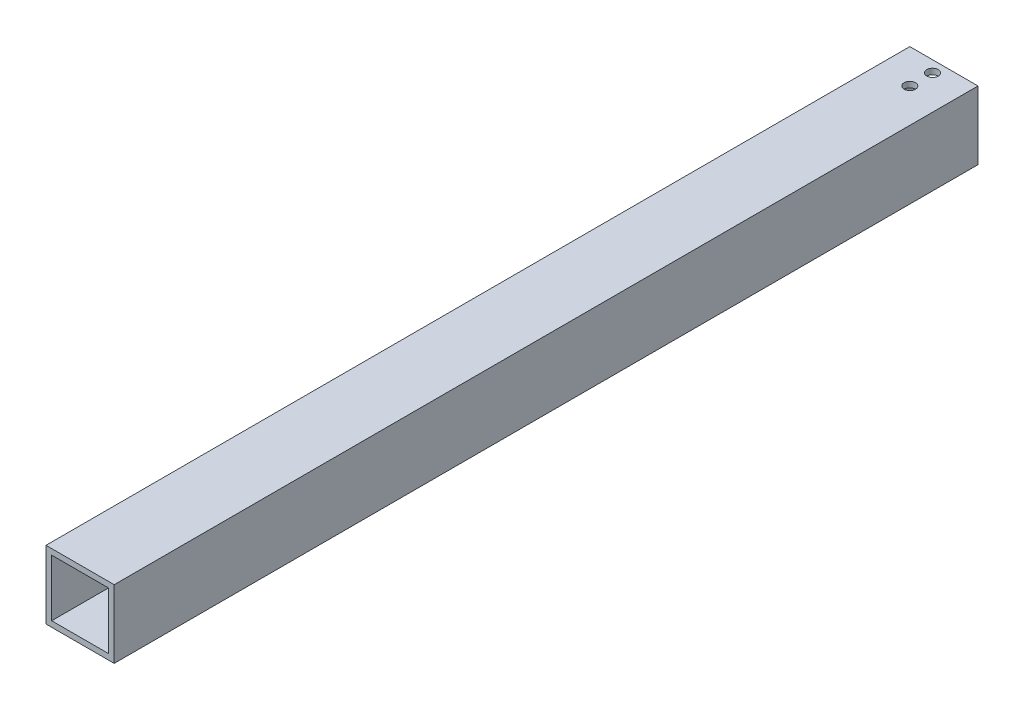
ISO-10303-21;
HEADER;
FILE_DESCRIPTION(('STEP AP214'),'2;1');
FILE_NAME('part.step','',(''),(''),'','','');
FILE_SCHEMA(('AUTOMOTIVE_DESIGN { 1 0 10303 214 1 1 1 1 }'));
ENDSEC;
DATA;
#1=APPLICATION_CONTEXT('core data for automotive mechanical design processes');
#2=APPLICATION_PROTOCOL_DEFINITION('international standard','automotive_design',2000,#1);
#3=PRODUCT_CONTEXT('',#1,'mechanical');
#4=PRODUCT('Part','Part','',(#3));
#5=PRODUCT_RELATED_PRODUCT_CATEGORY('part','',(#4));
#6=PRODUCT_DEFINITION_FORMATION('','',#4);
#7=PRODUCT_DEFINITION_CONTEXT('part definition',#1,'design');
#8=PRODUCT_DEFINITION('design','',#6,#7);
#9=PRODUCT_DEFINITION_SHAPE('','',#8);
#10=(LENGTH_UNIT() NAMED_UNIT(*) SI_UNIT(.MILLI.,.METRE.));
#11=(NAMED_UNIT(*) PLANE_ANGLE_UNIT() SI_UNIT($,.RADIAN.));
#12=(NAMED_UNIT(*) SI_UNIT($,.STERADIAN.) SOLID_ANGLE_UNIT());
#13=UNCERTAINTY_MEASURE_WITH_UNIT(LENGTH_MEASURE(1.E-05),#10,'distance_accuracy_value','');
#14=(GEOMETRIC_REPRESENTATION_CONTEXT(3) GLOBAL_UNCERTAINTY_ASSIGNED_CONTEXT((#13)) GLOBAL_UNIT_ASSIGNED_CONTEXT((#10,
#11,#12)) REPRESENTATION_CONTEXT('',''));
#15=CARTESIAN_POINT('',(0.,0.,0.));
#16=DIRECTION('',(0.,0.,1.));
#17=DIRECTION('',(1.,0.,0.));
#18=AXIS2_PLACEMENT_3D('',#15,#16,#17);
#19=CARTESIAN_POINT('',(0.,0.,482.6));
#20=DIRECTION('',(0.,0.,1.));
#21=DIRECTION('',(1.,0.,0.));
#22=AXIS2_PLACEMENT_3D('',#19,#20,#21);
#23=PLANE('',#22);
#24=DIRECTION('',(0.,1.,0.));
#25=VECTOR('',#24,1.);
#26=CARTESIAN_POINT('',(19.05,19.05,482.6));
#27=LINE('',#26,#25);
#28=CARTESIAN_POINT('',(19.05,-19.05,482.6));
#29=VERTEX_POINT('',#28);
#30=CARTESIAN_POINT('',(19.05,19.05,482.6));
#31=VERTEX_POINT('',#30);
#32=EDGE_CURVE('E144',#29,#31,#27,.T.);
#33=ORIENTED_EDGE('',*,*,#32,.T.);
#34=DIRECTION('',(-1.,0.,0.));
#35=VECTOR('',#34,1.);
#36=CARTESIAN_POINT('',(-19.05,19.05,482.6));
#37=LINE('',#36,#35);
#38=CARTESIAN_POINT('',(-19.05,19.05,482.6));
#39=VERTEX_POINT('',#38);
#40=EDGE_CURVE('E147',#31,#39,#37,.T.);
#41=ORIENTED_EDGE('',*,*,#40,.T.);
#42=DIRECTION('',(0.,-1.,0.));
#43=VECTOR('',#42,1.);
#44=CARTESIAN_POINT('',(-19.05,19.05,482.6));
#45=LINE('',#44,#43);
#46=CARTESIAN_POINT('',(-19.05,-19.05,482.6));
#47=VERTEX_POINT('',#46);
#48=EDGE_CURVE('E150',#39,#47,#45,.T.);
#49=ORIENTED_EDGE('',*,*,#48,.T.);
#50=DIRECTION('',(1.,0.,0.));
#51=VECTOR('',#50,1.);
#52=CARTESIAN_POINT('',(-19.05,-19.05,482.6));
#53=LINE('',#52,#51);
#54=EDGE_CURVE('E152',#47,#29,#53,.T.);
#55=ORIENTED_EDGE('',*,*,#54,.T.);
#56=EDGE_LOOP('',(#33,#41,#49,#55));
#57=FACE_BOUND('',#56,.T.);
#58=DIRECTION('',(-1.,0.,0.));
#59=VECTOR('',#58,1.);
#60=CARTESIAN_POINT('',(-15.875,15.875,482.6));
#61=LINE('',#60,#59);
#62=CARTESIAN_POINT('',(15.875,15.875,482.6));
#63=VERTEX_POINT('',#62);
#64=CARTESIAN_POINT('',(-15.875,15.875,482.6));
#65=VERTEX_POINT('',#64);
#66=EDGE_CURVE('E114',#63,#65,#61,.T.);
#67=ORIENTED_EDGE('',*,*,#66,.F.);
#68=DIRECTION('',(0.,1.,0.));
#69=VECTOR('',#68,1.);
#70=CARTESIAN_POINT('',(15.875,-15.875,482.6));
#71=LINE('',#70,#69);
#72=CARTESIAN_POINT('',(15.875,-15.875,482.6));
#73=VERTEX_POINT('',#72);
#74=EDGE_CURVE('E106',#73,#63,#71,.T.);
#75=ORIENTED_EDGE('',*,*,#74,.F.);
#76=DIRECTION('',(1.,0.,0.));
#77=VECTOR('',#76,1.);
#78=CARTESIAN_POINT('',(-15.875,-15.875,482.6));
#79=LINE('',#78,#77);
#80=CARTESIAN_POINT('',(-15.875,-15.875,482.6));
#81=VERTEX_POINT('',#80);
#82=EDGE_CURVE('E128',#81,#73,#79,.T.);
#83=ORIENTED_EDGE('',*,*,#82,.F.);
#84=DIRECTION('',(0.,-1.,0.));
#85=VECTOR('',#84,1.);
#86=CARTESIAN_POINT('',(-15.875,-15.875,482.6));
#87=LINE('',#86,#85);
#88=EDGE_CURVE('E126',#65,#81,#87,.T.);
#89=ORIENTED_EDGE('',*,*,#88,.F.);
#90=EDGE_LOOP('',(#67,#75,#83,#89));
#91=FACE_BOUND('',#90,.T.);
#92=ADVANCED_FACE('F39',(#57,#91),#23,.T.);
#93=CARTESIAN_POINT('',(0.,0.,0.));
#94=DIRECTION('',(0.,0.,1.));
#95=DIRECTION('',(1.,0.,0.));
#96=AXIS2_PLACEMENT_3D('',#93,#94,#95);
#97=PLANE('',#96);
#98=DIRECTION('',(0.,1.,0.));
#99=VECTOR('',#98,1.);
#100=CARTESIAN_POINT('',(19.05,19.05,0.));
#101=LINE('',#100,#99);
#102=CARTESIAN_POINT('',(19.05,-19.05,0.));
#103=VERTEX_POINT('',#102);
#104=CARTESIAN_POINT('',(19.05,19.05,0.));
#105=VERTEX_POINT('',#104);
#106=EDGE_CURVE('E122',#103,#105,#101,.T.);
#107=ORIENTED_EDGE('',*,*,#106,.F.);
#108=DIRECTION('',(1.,0.,0.));
#109=VECTOR('',#108,1.);
#110=CARTESIAN_POINT('',(-19.05,-19.05,0.));
#111=LINE('',#110,#109);
#112=CARTESIAN_POINT('',(-19.05,-19.05,0.));
#113=VERTEX_POINT('',#112);
#114=EDGE_CURVE('E148',#113,#103,#111,.T.);
#115=ORIENTED_EDGE('',*,*,#114,.F.);
#116=DIRECTION('',(0.,-1.,0.));
#117=VECTOR('',#116,1.);
#118=CARTESIAN_POINT('',(-19.05,19.05,0.));
#119=LINE('',#118,#117);
#120=CARTESIAN_POINT('',(-19.05,19.05,0.));
#121=VERTEX_POINT('',#120);
#122=EDGE_CURVE('E159',#121,#113,#119,.T.);
#123=ORIENTED_EDGE('',*,*,#122,.F.);
#124=DIRECTION('',(-1.,0.,0.));
#125=VECTOR('',#124,1.);
#126=CARTESIAN_POINT('',(-19.05,19.05,0.));
#127=LINE('',#126,#125);
#128=EDGE_CURVE('E157',#105,#121,#127,.T.);
#129=ORIENTED_EDGE('',*,*,#128,.F.);
#130=EDGE_LOOP('',(#107,#115,#123,#129));
#131=FACE_BOUND('',#130,.T.);
#132=DIRECTION('',(0.,1.,0.));
#133=VECTOR('',#132,1.);
#134=CARTESIAN_POINT('',(15.875,-15.875,0.));
#135=LINE('',#134,#133);
#136=CARTESIAN_POINT('',(15.875,-15.875,0.));
#137=VERTEX_POINT('',#136);
#138=CARTESIAN_POINT('',(15.875,15.875,0.));
#139=VERTEX_POINT('',#138);
#140=EDGE_CURVE('E64',#137,#139,#135,.T.);
#141=ORIENTED_EDGE('',*,*,#140,.T.);
#142=DIRECTION('',(-1.,0.,0.));
#143=VECTOR('',#142,1.);
#144=CARTESIAN_POINT('',(-15.875,15.875,0.));
#145=LINE('',#144,#143);
#146=CARTESIAN_POINT('',(-15.875,15.875,0.));
#147=VERTEX_POINT('',#146);
#148=EDGE_CURVE('E121',#139,#147,#145,.T.);
#149=ORIENTED_EDGE('',*,*,#148,.T.);
#150=DIRECTION('',(0.,-1.,0.));
#151=VECTOR('',#150,1.);
#152=CARTESIAN_POINT('',(-15.875,-15.875,0.));
#153=LINE('',#152,#151);
#154=CARTESIAN_POINT('',(-15.875,-15.875,0.));
#155=VERTEX_POINT('',#154);
#156=EDGE_CURVE('E136',#147,#155,#153,.T.);
#157=ORIENTED_EDGE('',*,*,#156,.T.);
#158=DIRECTION('',(1.,0.,0.));
#159=VECTOR('',#158,1.);
#160=CARTESIAN_POINT('',(-15.875,-15.875,0.));
#161=LINE('',#160,#159);
#162=EDGE_CURVE('E115',#155,#137,#161,.T.);
#163=ORIENTED_EDGE('',*,*,#162,.T.);
#164=EDGE_LOOP('',(#141,#149,#157,#163));
#165=FACE_BOUND('',#164,.T.);
#166=ADVANCED_FACE('F206',(#131,#165),#97,.F.);
#167=CARTESIAN_POINT('',(19.05,19.05,482.6));
#168=DIRECTION('',(-1.,0.,0.));
#169=DIRECTION('',(0.,-1.,0.));
#170=AXIS2_PLACEMENT_3D('',#167,#168,#169);
#171=PLANE('',#170);
#172=ORIENTED_EDGE('',*,*,#106,.T.);
#173=DIRECTION('',(0.,0.,-1.));
#174=VECTOR('',#173,1.);
#175=CARTESIAN_POINT('',(19.05,19.05,482.6));
#176=LINE('',#175,#174);
#177=EDGE_CURVE('E11',#31,#105,#176,.T.);
#178=ORIENTED_EDGE('',*,*,#177,.F.);
#179=ORIENTED_EDGE('',*,*,#32,.F.);
#180=DIRECTION('',(0.,0.,-1.));
#181=VECTOR('',#180,1.);
#182=CARTESIAN_POINT('',(19.05,-19.05,482.6));
#183=LINE('',#182,#181);
#184=EDGE_CURVE('E154',#29,#103,#183,.T.);
#185=ORIENTED_EDGE('',*,*,#184,.T.);
#186=EDGE_LOOP('',(#172,#178,#179,#185));
#187=FACE_BOUND('',#186,.T.);
#188=ADVANCED_FACE('F41',(#187),#171,.F.);
#189=CARTESIAN_POINT('',(-19.05,19.05,482.6));
#190=DIRECTION('',(0.,-1.,0.));
#191=DIRECTION('',(0.,0.,-1.));
#192=AXIS2_PLACEMENT_3D('',#189,#190,#191);
#193=PLANE('',#192);
#194=CARTESIAN_POINT('',(0.,19.05,19.05));
#195=DIRECTION('',(0.,1.,0.));
#196=DIRECTION('',(0.,0.,1.));
#197=AXIS2_PLACEMENT_3D('',#194,#195,#196);
#198=CIRCLE('',#197,3.175);
#199=CARTESIAN_POINT('',(0.,19.05,22.225));
#200=VERTEX_POINT('',#199);
#201=EDGE_CURVE('E177',#200,#200,#198,.T.);
#202=ORIENTED_EDGE('',*,*,#201,.F.);
#203=EDGE_LOOP('',(#202));
#204=FACE_BOUND('',#203,.T.);
#205=CARTESIAN_POINT('',(0.,19.05,6.35000000000002));
#206=DIRECTION('',(0.,1.,0.));
#207=DIRECTION('',(0.,0.,1.));
#208=AXIS2_PLACEMENT_3D('',#205,#206,#207);
#209=CIRCLE('',#208,3.175);
#210=CARTESIAN_POINT('',(0.,19.05,9.52500000000002));
#211=VERTEX_POINT('',#210);
#212=EDGE_CURVE('E182',#211,#211,#209,.T.);
#213=ORIENTED_EDGE('',*,*,#212,.F.);
#214=EDGE_LOOP('',(#213));
#215=FACE_BOUND('',#214,.T.);
#216=ORIENTED_EDGE('',*,*,#128,.T.);
#217=DIRECTION('',(0.,0.,-1.));
#218=VECTOR('',#217,1.);
#219=CARTESIAN_POINT('',(-19.05,19.05,482.6));
#220=LINE('',#219,#218);
#221=EDGE_CURVE('E48',#39,#121,#220,.T.);
#222=ORIENTED_EDGE('',*,*,#221,.F.);
#223=ORIENTED_EDGE('',*,*,#40,.F.);
#224=ORIENTED_EDGE('',*,*,#177,.T.);
#225=EDGE_LOOP('',(#216,#222,#223,#224));
#226=FACE_BOUND('',#225,.T.);
#227=ADVANCED_FACE('F230',(#204,#215,#226),#193,.F.);
#228=CARTESIAN_POINT('',(-19.05,19.05,482.6));
#229=DIRECTION('',(1.,0.,0.));
#230=DIRECTION('',(0.,0.,-1.));
#231=AXIS2_PLACEMENT_3D('',#228,#229,#230);
#232=PLANE('',#231);
#233=ORIENTED_EDGE('',*,*,#122,.T.);
#234=DIRECTION('',(0.,0.,-1.));
#235=VECTOR('',#234,1.);
#236=CARTESIAN_POINT('',(-19.05,-19.05,482.6));
#237=LINE('',#236,#235);
#238=EDGE_CURVE('E164',#47,#113,#237,.T.);
#239=ORIENTED_EDGE('',*,*,#238,.F.);
#240=ORIENTED_EDGE('',*,*,#48,.F.);
#241=ORIENTED_EDGE('',*,*,#221,.T.);
#242=EDGE_LOOP('',(#233,#239,#240,#241));
#243=FACE_BOUND('',#242,.T.);
#244=ADVANCED_FACE('F228',(#243),#232,.F.);
#245=CARTESIAN_POINT('',(-19.05,-19.05,482.6));
#246=DIRECTION('',(0.,1.,0.));
#247=DIRECTION('',(0.,0.,1.));
#248=AXIS2_PLACEMENT_3D('',#245,#246,#247);
#249=PLANE('',#248);
#250=CARTESIAN_POINT('',(0.,-19.05,19.05));
#251=DIRECTION('',(0.,1.,0.));
#252=DIRECTION('',(0.,0.,1.));
#253=AXIS2_PLACEMENT_3D('',#250,#251,#252);
#254=CIRCLE('',#253,3.175);
#255=CARTESIAN_POINT('',(0.,-19.05,22.225));
#256=VERTEX_POINT('',#255);
#257=EDGE_CURVE('E171',#256,#256,#254,.T.);
#258=ORIENTED_EDGE('',*,*,#257,.T.);
#259=EDGE_LOOP('',(#258));
#260=FACE_BOUND('',#259,.T.);
#261=CARTESIAN_POINT('',(0.,-19.05,6.35000000000002));
#262=DIRECTION('',(0.,1.,0.));
#263=DIRECTION('',(0.,0.,1.));
#264=AXIS2_PLACEMENT_3D('',#261,#262,#263);
#265=CIRCLE('',#264,3.175);
#266=CARTESIAN_POINT('',(0.,-19.05,9.52500000000002));
#267=VERTEX_POINT('',#266);
#268=EDGE_CURVE('E187',#267,#267,#265,.T.);
#269=ORIENTED_EDGE('',*,*,#268,.T.);
#270=EDGE_LOOP('',(#269));
#271=FACE_BOUND('',#270,.T.);
#272=ORIENTED_EDGE('',*,*,#114,.T.);
#273=ORIENTED_EDGE('',*,*,#184,.F.);
#274=ORIENTED_EDGE('',*,*,#54,.F.);
#275=ORIENTED_EDGE('',*,*,#238,.T.);
#276=EDGE_LOOP('',(#272,#273,#274,#275));
#277=FACE_BOUND('',#276,.T.);
#278=ADVANCED_FACE('F225',(#260,#271,#277),#249,.F.);
#279=CARTESIAN_POINT('',(15.875,-15.875,482.6));
#280=DIRECTION('',(-1.,0.,0.));
#281=DIRECTION('',(0.,0.,1.));
#282=AXIS2_PLACEMENT_3D('',#279,#280,#281);
#283=PLANE('',#282);
#284=ORIENTED_EDGE('',*,*,#140,.F.);
#285=DIRECTION('',(0.,0.,-1.));
#286=VECTOR('',#285,1.);
#287=CARTESIAN_POINT('',(15.875,-15.875,482.6));
#288=LINE('',#287,#286);
#289=EDGE_CURVE('E110',#73,#137,#288,.T.);
#290=ORIENTED_EDGE('',*,*,#289,.F.);
#291=ORIENTED_EDGE('',*,*,#74,.T.);
#292=DIRECTION('',(0.,0.,-1.));
#293=VECTOR('',#292,1.);
#294=CARTESIAN_POINT('',(15.875,15.875,482.6));
#295=LINE('',#294,#293);
#296=EDGE_CURVE('E109',#63,#139,#295,.T.);
#297=ORIENTED_EDGE('',*,*,#296,.T.);
#298=EDGE_LOOP('',(#284,#290,#291,#297));
#299=FACE_BOUND('',#298,.T.);
#300=ADVANCED_FACE('F108',(#299),#283,.T.);
#301=CARTESIAN_POINT('',(-15.875,15.875,482.6));
#302=DIRECTION('',(0.,-1.,0.));
#303=DIRECTION('',(0.,0.,-1.));
#304=AXIS2_PLACEMENT_3D('',#301,#302,#303);
#305=PLANE('',#304);
#306=CARTESIAN_POINT('',(0.,15.875,19.05));
#307=DIRECTION('',(0.,-1.,0.));
#308=DIRECTION('',(0.,0.,-1.));
#309=AXIS2_PLACEMENT_3D('',#306,#307,#308);
#310=CIRCLE('',#309,3.175);
#311=CARTESIAN_POINT('',(0.,15.875,22.225));
#312=VERTEX_POINT('',#311);
#313=EDGE_CURVE('E134',#312,#312,#310,.T.);
#314=ORIENTED_EDGE('',*,*,#313,.F.);
#315=EDGE_LOOP('',(#314));
#316=FACE_BOUND('',#315,.T.);
#317=CARTESIAN_POINT('',(0.,15.875,6.35000000000002));
#318=DIRECTION('',(0.,-1.,0.));
#319=DIRECTION('',(0.,0.,-1.));
#320=AXIS2_PLACEMENT_3D('',#317,#318,#319);
#321=CIRCLE('',#320,3.175);
#322=CARTESIAN_POINT('',(0.,15.875,9.52500000000002));
#323=VERTEX_POINT('',#322);
#324=EDGE_CURVE('E170',#323,#323,#321,.T.);
#325=ORIENTED_EDGE('',*,*,#324,.F.);
#326=EDGE_LOOP('',(#325));
#327=FACE_BOUND('',#326,.T.);
#328=ORIENTED_EDGE('',*,*,#148,.F.);
#329=ORIENTED_EDGE('',*,*,#296,.F.);
#330=ORIENTED_EDGE('',*,*,#66,.T.);
#331=DIRECTION('',(0.,0.,-1.));
#332=VECTOR('',#331,1.);
#333=CARTESIAN_POINT('',(-15.875,15.875,482.6));
#334=LINE('',#333,#332);
#335=EDGE_CURVE('E123',#65,#147,#334,.T.);
#336=ORIENTED_EDGE('',*,*,#335,.T.);
#337=EDGE_LOOP('',(#328,#329,#330,#336));
#338=FACE_BOUND('',#337,.T.);
#339=ADVANCED_FACE('F118',(#316,#327,#338),#305,.T.);
#340=CARTESIAN_POINT('',(-15.875,-15.875,482.6));
#341=DIRECTION('',(1.,0.,0.));
#342=DIRECTION('',(0.,0.,-1.));
#343=AXIS2_PLACEMENT_3D('',#340,#341,#342);
#344=PLANE('',#343);
#345=ORIENTED_EDGE('',*,*,#156,.F.);
#346=ORIENTED_EDGE('',*,*,#335,.F.);
#347=ORIENTED_EDGE('',*,*,#88,.T.);
#348=DIRECTION('',(0.,0.,-1.));
#349=VECTOR('',#348,1.);
#350=CARTESIAN_POINT('',(-15.875,-15.875,482.6));
#351=LINE('',#350,#349);
#352=EDGE_CURVE('E56',#81,#155,#351,.T.);
#353=ORIENTED_EDGE('',*,*,#352,.T.);
#354=EDGE_LOOP('',(#345,#346,#347,#353));
#355=FACE_BOUND('',#354,.T.);
#356=ADVANCED_FACE('F202',(#355),#344,.T.);
#357=CARTESIAN_POINT('',(-15.875,-15.875,482.6));
#358=DIRECTION('',(0.,1.,0.));
#359=DIRECTION('',(0.,0.,1.));
#360=AXIS2_PLACEMENT_3D('',#357,#358,#359);
#361=PLANE('',#360);
#362=CARTESIAN_POINT('',(0.,-15.875,19.05));
#363=DIRECTION('',(0.,1.,0.));
#364=DIRECTION('',(0.,0.,1.));
#365=AXIS2_PLACEMENT_3D('',#362,#363,#364);
#366=CIRCLE('',#365,3.175);
#367=CARTESIAN_POINT('',(0.,-15.875,22.225));
#368=VERTEX_POINT('',#367);
#369=EDGE_CURVE('E43',#368,#368,#366,.T.);
#370=ORIENTED_EDGE('',*,*,#369,.F.);
#371=EDGE_LOOP('',(#370));
#372=FACE_BOUND('',#371,.T.);
#373=CARTESIAN_POINT('',(0.,-15.875,6.35000000000002));
#374=DIRECTION('',(0.,1.,0.));
#375=DIRECTION('',(0.,0.,1.));
#376=AXIS2_PLACEMENT_3D('',#373,#374,#375);
#377=CIRCLE('',#376,3.175);
#378=CARTESIAN_POINT('',(0.,-15.875,9.52500000000002));
#379=VERTEX_POINT('',#378);
#380=EDGE_CURVE('E168',#379,#379,#377,.T.);
#381=ORIENTED_EDGE('',*,*,#380,.F.);
#382=EDGE_LOOP('',(#381));
#383=FACE_BOUND('',#382,.T.);
#384=ORIENTED_EDGE('',*,*,#162,.F.);
#385=ORIENTED_EDGE('',*,*,#352,.F.);
#386=ORIENTED_EDGE('',*,*,#82,.T.);
#387=ORIENTED_EDGE('',*,*,#289,.T.);
#388=EDGE_LOOP('',(#384,#385,#386,#387));
#389=FACE_BOUND('',#388,.T.);
#390=ADVANCED_FACE('F198',(#372,#383,#389),#361,.T.);
#391=CARTESIAN_POINT('',(0.,-19.05,6.35000000000002));
#392=DIRECTION('',(0.,1.,0.));
#393=DIRECTION('',(0.,0.,1.));
#394=AXIS2_PLACEMENT_3D('',#391,#392,#393);
#395=CYLINDRICAL_SURFACE('',#394,3.175);
#396=CARTESIAN_POINT('',(0.,-15.875,9.52500000000002));
#397=CARTESIAN_POINT('',(0.,-15.9080729166667,9.52500000000002));
#398=CARTESIAN_POINT('',(0.,-15.9411458333333,9.52500000000002));
#399=CARTESIAN_POINT('',(0.,-16.0072916666667,9.52500000000002));
#400=CARTESIAN_POINT('',(0.,-16.0403645833333,9.52500000000002));
#401=CARTESIAN_POINT('',(0.,-16.1065104166667,9.52500000000002));
#402=CARTESIAN_POINT('',(0.,-16.1395833333333,9.52500000000002));
#403=CARTESIAN_POINT('',(0.,-16.2057291666667,9.52500000000002));
#404=CARTESIAN_POINT('',(0.,-16.2388020833333,9.52500000000002));
#405=CARTESIAN_POINT('',(0.,-16.3049479166667,9.52500000000002));
#406=CARTESIAN_POINT('',(0.,-16.3380208333333,9.52500000000002));
#407=CARTESIAN_POINT('',(0.,-16.4041666666667,9.52500000000002));
#408=CARTESIAN_POINT('',(0.,-16.4372395833333,9.52500000000002));
#409=CARTESIAN_POINT('',(0.,-16.5033854166667,9.52500000000002));
#410=CARTESIAN_POINT('',(0.,-16.5364583333333,9.52500000000002));
#411=CARTESIAN_POINT('',(0.,-16.6026041666667,9.52500000000002));
#412=CARTESIAN_POINT('',(0.,-16.6356770833333,9.52500000000002));
#413=CARTESIAN_POINT('',(0.,-16.7018229166667,9.52500000000002));
#414=CARTESIAN_POINT('',(0.,-16.7348958333333,9.52500000000002));
#415=CARTESIAN_POINT('',(0.,-16.8010416666667,9.52500000000002));
#416=CARTESIAN_POINT('',(0.,-16.8341145833333,9.52500000000002));
#417=CARTESIAN_POINT('',(0.,-16.9002604166667,9.52500000000002));
#418=CARTESIAN_POINT('',(0.,-16.9333333333333,9.52500000000002));
#419=CARTESIAN_POINT('',(0.,-16.9994791666667,9.52500000000002));
#420=CARTESIAN_POINT('',(0.,-17.0325520833333,9.52500000000002));
#421=CARTESIAN_POINT('',(0.,-17.0986979166667,9.52500000000002));
#422=CARTESIAN_POINT('',(0.,-17.1317708333333,9.52500000000002));
#423=CARTESIAN_POINT('',(0.,-17.1979166666667,9.52500000000002));
#424=CARTESIAN_POINT('',(0.,-17.2309895833333,9.52500000000002));
#425=CARTESIAN_POINT('',(0.,-17.2971354166667,9.52500000000002));
#426=CARTESIAN_POINT('',(0.,-17.3302083333333,9.52500000000002));
#427=CARTESIAN_POINT('',(0.,-17.3963541666667,9.52500000000002));
#428=CARTESIAN_POINT('',(0.,-17.4294270833333,9.52500000000002));
#429=CARTESIAN_POINT('',(0.,-17.4955729166667,9.52500000000002));
#430=CARTESIAN_POINT('',(0.,-17.5286458333333,9.52500000000002));
#431=CARTESIAN_POINT('',(0.,-17.5947916666667,9.52500000000002));
#432=CARTESIAN_POINT('',(0.,-17.6278645833333,9.52500000000002));
#433=CARTESIAN_POINT('',(0.,-17.6940104166667,9.52500000000002));
#434=CARTESIAN_POINT('',(0.,-17.7270833333333,9.52500000000002));
#435=CARTESIAN_POINT('',(0.,-17.7932291666667,9.52500000000002));
#436=CARTESIAN_POINT('',(0.,-17.8263020833333,9.52500000000002));
#437=CARTESIAN_POINT('',(0.,-17.8924479166667,9.52500000000002));
#438=CARTESIAN_POINT('',(0.,-17.9255208333333,9.52500000000002));
#439=CARTESIAN_POINT('',(0.,-17.9916666666667,9.52500000000002));
#440=CARTESIAN_POINT('',(0.,-18.0247395833333,9.52500000000002));
#441=CARTESIAN_POINT('',(0.,-18.0908854166667,9.52500000000002));
#442=CARTESIAN_POINT('',(0.,-18.1239583333333,9.52500000000002));
#443=CARTESIAN_POINT('',(0.,-18.1901041666667,9.52500000000002));
#444=CARTESIAN_POINT('',(0.,-18.2231770833333,9.52500000000002));
#445=CARTESIAN_POINT('',(0.,-18.2893229166667,9.52500000000002));
#446=CARTESIAN_POINT('',(0.,-18.3223958333333,9.52500000000002));
#447=CARTESIAN_POINT('',(0.,-18.3885416666667,9.52500000000002));
#448=CARTESIAN_POINT('',(0.,-18.4216145833333,9.52500000000002));
#449=CARTESIAN_POINT('',(0.,-18.4877604166667,9.52500000000002));
#450=CARTESIAN_POINT('',(0.,-18.5208333333333,9.52500000000002));
#451=CARTESIAN_POINT('',(0.,-18.5869791666667,9.52500000000002));
#452=CARTESIAN_POINT('',(0.,-18.6200520833333,9.52500000000002));
#453=CARTESIAN_POINT('',(0.,-18.6861979166667,9.52500000000002));
#454=CARTESIAN_POINT('',(0.,-18.7192708333333,9.52500000000002));
#455=CARTESIAN_POINT('',(0.,-18.7854166666667,9.52500000000002));
#456=CARTESIAN_POINT('',(0.,-18.8184895833333,9.52500000000002));
#457=CARTESIAN_POINT('',(0.,-18.8846354166667,9.52500000000002));
#458=CARTESIAN_POINT('',(0.,-18.9177083333333,9.52500000000002));
#459=CARTESIAN_POINT('',(0.,-18.9838541666667,9.52500000000002));
#460=CARTESIAN_POINT('',(0.,-19.0169270833333,9.52500000000002));
#461=CARTESIAN_POINT('',(0.,-19.05,9.52500000000002));
#462=B_SPLINE_CURVE_WITH_KNOTS('',3,(#396,#397,#398,#399,#400,#401,#402,#403,#404,#405,#406,
#407,#408,#409,#410,#411,#412,#413,#414,#415,#416,#417,#418,#419,#420,#421,#422,#423,#424,#425,
#426,#427,#428,#429,#430,#431,#432,#433,#434,#435,#436,#437,#438,#439,#440,#441,#442,#443,#444,
#445,#446,#447,#448,#449,#450,#451,#452,#453,#454,#455,#456,#457,#458,#459,#460,#461),
.UNSPECIFIED.,.F.,.F.,(4,2,2,2,2,2,2,2,2,2,2,2,2,2,2,2,2,2,2,2,2,2,2,2,2,2,2,2,2,2,2,2,4),(0.,
0.0992187500000012,0.198437500000002,0.297656250000004,0.396875000000001,0.496093750000003,
0.595312500000004,0.694531250000002,0.793750000000003,0.892968750000004,0.992187500000002,
1.09140625,1.190625,1.28984375,1.3890625,1.48828125,1.5875,1.68671875,1.7859375,1.88515625,
1.984375,2.08359375,2.18281250000001,2.28203125,2.38125,2.48046875000001,2.5796875,
2.67890625000001,2.77812500000001,2.87734375,2.97656250000001,3.07578125000001,3.175),.UNSPECIFIED.);
#463=EDGE_CURVE('BSEAM201',#379,#267,#462,.T.);
#464=ORIENTED_EDGE('',*,*,#380,.T.);
#465=ORIENTED_EDGE('',*,*,#268,.F.);
#466=ORIENTED_EDGE('',*,*,#463,.T.);
#467=ORIENTED_EDGE('',*,*,#463,.F.);
#468=EDGE_LOOP('',(#464,#466,#465,#467));
#469=FACE_BOUND('',#468,.T.);
#470=ADVANCED_FACE('F201',(#469),#395,.F.);
#471=CARTESIAN_POINT('',(0.,-19.05,19.05));
#472=DIRECTION('',(0.,1.,0.));
#473=DIRECTION('',(0.,0.,1.));
#474=AXIS2_PLACEMENT_3D('',#471,#472,#473);
#475=CYLINDRICAL_SURFACE('',#474,3.175);
#476=CARTESIAN_POINT('',(0.,-15.875,22.225));
#477=CARTESIAN_POINT('',(0.,-15.9080729166667,22.225));
#478=CARTESIAN_POINT('',(0.,-15.9411458333333,22.225));
#479=CARTESIAN_POINT('',(0.,-16.0072916666667,22.225));
#480=CARTESIAN_POINT('',(0.,-16.0403645833333,22.225));
#481=CARTESIAN_POINT('',(0.,-16.1065104166667,22.225));
#482=CARTESIAN_POINT('',(0.,-16.1395833333333,22.225));
#483=CARTESIAN_POINT('',(0.,-16.2057291666667,22.225));
#484=CARTESIAN_POINT('',(0.,-16.2388020833333,22.225));
#485=CARTESIAN_POINT('',(0.,-16.3049479166667,22.225));
#486=CARTESIAN_POINT('',(0.,-16.3380208333333,22.225));
#487=CARTESIAN_POINT('',(0.,-16.4041666666667,22.225));
#488=CARTESIAN_POINT('',(0.,-16.4372395833333,22.225));
#489=CARTESIAN_POINT('',(0.,-16.5033854166667,22.225));
#490=CARTESIAN_POINT('',(0.,-16.5364583333333,22.225));
#491=CARTESIAN_POINT('',(0.,-16.6026041666667,22.225));
#492=CARTESIAN_POINT('',(0.,-16.6356770833333,22.225));
#493=CARTESIAN_POINT('',(0.,-16.7018229166667,22.225));
#494=CARTESIAN_POINT('',(0.,-16.7348958333333,22.225));
#495=CARTESIAN_POINT('',(0.,-16.8010416666667,22.225));
#496=CARTESIAN_POINT('',(0.,-16.8341145833333,22.225));
#497=CARTESIAN_POINT('',(0.,-16.9002604166667,22.225));
#498=CARTESIAN_POINT('',(0.,-16.9333333333333,22.225));
#499=CARTESIAN_POINT('',(0.,-16.9994791666667,22.225));
#500=CARTESIAN_POINT('',(0.,-17.0325520833333,22.225));
#501=CARTESIAN_POINT('',(0.,-17.0986979166667,22.225));
#502=CARTESIAN_POINT('',(0.,-17.1317708333333,22.225));
#503=CARTESIAN_POINT('',(0.,-17.1979166666667,22.225));
#504=CARTESIAN_POINT('',(0.,-17.2309895833333,22.225));
#505=CARTESIAN_POINT('',(0.,-17.2971354166667,22.225));
#506=CARTESIAN_POINT('',(0.,-17.3302083333333,22.225));
#507=CARTESIAN_POINT('',(0.,-17.3963541666667,22.225));
#508=CARTESIAN_POINT('',(0.,-17.4294270833333,22.225));
#509=CARTESIAN_POINT('',(0.,-17.4955729166667,22.225));
#510=CARTESIAN_POINT('',(0.,-17.5286458333333,22.225));
#511=CARTESIAN_POINT('',(0.,-17.5947916666667,22.225));
#512=CARTESIAN_POINT('',(0.,-17.6278645833333,22.225));
#513=CARTESIAN_POINT('',(0.,-17.6940104166667,22.225));
#514=CARTESIAN_POINT('',(0.,-17.7270833333333,22.225));
#515=CARTESIAN_POINT('',(0.,-17.7932291666667,22.225));
#516=CARTESIAN_POINT('',(0.,-17.8263020833333,22.225));
#517=CARTESIAN_POINT('',(0.,-17.8924479166667,22.225));
#518=CARTESIAN_POINT('',(0.,-17.9255208333333,22.225));
#519=CARTESIAN_POINT('',(0.,-17.9916666666667,22.225));
#520=CARTESIAN_POINT('',(0.,-18.0247395833333,22.225));
#521=CARTESIAN_POINT('',(0.,-18.0908854166667,22.225));
#522=CARTESIAN_POINT('',(0.,-18.1239583333333,22.225));
#523=CARTESIAN_POINT('',(0.,-18.1901041666667,22.225));
#524=CARTESIAN_POINT('',(0.,-18.2231770833333,22.225));
#525=CARTESIAN_POINT('',(0.,-18.2893229166667,22.225));
#526=CARTESIAN_POINT('',(0.,-18.3223958333333,22.225));
#527=CARTESIAN_POINT('',(0.,-18.3885416666667,22.225));
#528=CARTESIAN_POINT('',(0.,-18.4216145833333,22.225));
#529=CARTESIAN_POINT('',(0.,-18.4877604166667,22.225));
#530=CARTESIAN_POINT('',(0.,-18.5208333333333,22.225));
#531=CARTESIAN_POINT('',(0.,-18.5869791666667,22.225));
#532=CARTESIAN_POINT('',(0.,-18.6200520833333,22.225));
#533=CARTESIAN_POINT('',(0.,-18.6861979166667,22.225));
#534=CARTESIAN_POINT('',(0.,-18.7192708333333,22.225));
#535=CARTESIAN_POINT('',(0.,-18.7854166666667,22.225));
#536=CARTESIAN_POINT('',(0.,-18.8184895833333,22.225));
#537=CARTESIAN_POINT('',(0.,-18.8846354166667,22.225));
#538=CARTESIAN_POINT('',(0.,-18.9177083333333,22.225));
#539=CARTESIAN_POINT('',(0.,-18.9838541666667,22.225));
#540=CARTESIAN_POINT('',(0.,-19.0169270833333,22.225));
#541=CARTESIAN_POINT('',(0.,-19.05,22.225));
#542=B_SPLINE_CURVE_WITH_KNOTS('',3,(#476,#477,#478,#479,#480,#481,#482,#483,#484,#485,#486,
#487,#488,#489,#490,#491,#492,#493,#494,#495,#496,#497,#498,#499,#500,#501,#502,#503,#504,#505,
#506,#507,#508,#509,#510,#511,#512,#513,#514,#515,#516,#517,#518,#519,#520,#521,#522,#523,#524,
#525,#526,#527,#528,#529,#530,#531,#532,#533,#534,#535,#536,#537,#538,#539,#540,#541),
.UNSPECIFIED.,.F.,.F.,(4,2,2,2,2,2,2,2,2,2,2,2,2,2,2,2,2,2,2,2,2,2,2,2,2,2,2,2,2,2,2,2,4),(0.,
0.0992187500000012,0.198437500000002,0.297656250000004,0.396875000000001,0.496093750000003,
0.595312500000004,0.694531250000002,0.793750000000003,0.892968750000004,0.992187500000002,
1.09140625,1.190625,1.28984375,1.3890625,1.48828125,1.5875,1.68671875,1.7859375,1.88515625,
1.984375,2.08359375,2.18281250000001,2.28203125,2.38125,2.48046875000001,2.5796875,
2.67890625000001,2.77812500000001,2.87734375,2.97656250000001,3.07578125000001,3.175),.UNSPECIFIED.);
#543=EDGE_CURVE('BSEAM195',#368,#256,#542,.T.);
#544=ORIENTED_EDGE('',*,*,#369,.T.);
#545=ORIENTED_EDGE('',*,*,#257,.F.);
#546=ORIENTED_EDGE('',*,*,#543,.T.);
#547=ORIENTED_EDGE('',*,*,#543,.F.);
#548=EDGE_LOOP('',(#544,#546,#545,#547));
#549=FACE_BOUND('',#548,.T.);
#550=ADVANCED_FACE('F195',(#549),#475,.F.);
#551=CARTESIAN_POINT('',(0.,15.875,9.52500000000002));
#552=CARTESIAN_POINT('',(0.,15.9080729166667,9.52500000000002));
#553=CARTESIAN_POINT('',(0.,15.9411458333333,9.52500000000002));
#554=CARTESIAN_POINT('',(0.,16.0072916666667,9.52500000000002));
#555=CARTESIAN_POINT('',(0.,16.0403645833333,9.52500000000002));
#556=CARTESIAN_POINT('',(0.,16.1065104166667,9.52500000000002));
#557=CARTESIAN_POINT('',(0.,16.1395833333333,9.52500000000002));
#558=CARTESIAN_POINT('',(0.,16.2057291666667,9.52500000000002));
#559=CARTESIAN_POINT('',(0.,16.2388020833333,9.52500000000002));
#560=CARTESIAN_POINT('',(0.,16.3049479166667,9.52500000000002));
#561=CARTESIAN_POINT('',(0.,16.3380208333333,9.52500000000002));
#562=CARTESIAN_POINT('',(0.,16.4041666666667,9.52500000000002));
#563=CARTESIAN_POINT('',(0.,16.4372395833333,9.52500000000002));
#564=CARTESIAN_POINT('',(0.,16.5033854166667,9.52500000000002));
#565=CARTESIAN_POINT('',(0.,16.5364583333333,9.52500000000002));
#566=CARTESIAN_POINT('',(0.,16.6026041666667,9.52500000000002));
#567=CARTESIAN_POINT('',(0.,16.6356770833333,9.52500000000002));
#568=CARTESIAN_POINT('',(0.,16.7018229166667,9.52500000000002));
#569=CARTESIAN_POINT('',(0.,16.7348958333333,9.52500000000002));
#570=CARTESIAN_POINT('',(0.,16.8010416666667,9.52500000000002));
#571=CARTESIAN_POINT('',(0.,16.8341145833333,9.52500000000002));
#572=CARTESIAN_POINT('',(0.,16.9002604166667,9.52500000000002));
#573=CARTESIAN_POINT('',(0.,16.9333333333333,9.52500000000002));
#574=CARTESIAN_POINT('',(0.,16.9994791666667,9.52500000000002));
#575=CARTESIAN_POINT('',(0.,17.0325520833333,9.52500000000002));
#576=CARTESIAN_POINT('',(0.,17.0986979166667,9.52500000000002));
#577=CARTESIAN_POINT('',(0.,17.1317708333333,9.52500000000002));
#578=CARTESIAN_POINT('',(0.,17.1979166666667,9.52500000000002));
#579=CARTESIAN_POINT('',(0.,17.2309895833333,9.52500000000002));
#580=CARTESIAN_POINT('',(0.,17.2971354166667,9.52500000000002));
#581=CARTESIAN_POINT('',(0.,17.3302083333333,9.52500000000002));
#582=CARTESIAN_POINT('',(0.,17.3963541666667,9.52500000000002));
#583=CARTESIAN_POINT('',(0.,17.4294270833333,9.52500000000002));
#584=CARTESIAN_POINT('',(0.,17.4955729166667,9.52500000000002));
#585=CARTESIAN_POINT('',(0.,17.5286458333333,9.52500000000002));
#586=CARTESIAN_POINT('',(0.,17.5947916666667,9.52500000000002));
#587=CARTESIAN_POINT('',(0.,17.6278645833333,9.52500000000002));
#588=CARTESIAN_POINT('',(0.,17.6940104166667,9.52500000000002));
#589=CARTESIAN_POINT('',(0.,17.7270833333333,9.52500000000002));
#590=CARTESIAN_POINT('',(0.,17.7932291666667,9.52500000000002));
#591=CARTESIAN_POINT('',(0.,17.8263020833333,9.52500000000002));
#592=CARTESIAN_POINT('',(0.,17.8924479166667,9.52500000000002));
#593=CARTESIAN_POINT('',(0.,17.9255208333333,9.52500000000002));
#594=CARTESIAN_POINT('',(0.,17.9916666666667,9.52500000000002));
#595=CARTESIAN_POINT('',(0.,18.0247395833333,9.52500000000002));
#596=CARTESIAN_POINT('',(0.,18.0908854166667,9.52500000000002));
#597=CARTESIAN_POINT('',(0.,18.1239583333333,9.52500000000002));
#598=CARTESIAN_POINT('',(0.,18.1901041666667,9.52500000000002));
#599=CARTESIAN_POINT('',(0.,18.2231770833333,9.52500000000002));
#600=CARTESIAN_POINT('',(0.,18.2893229166667,9.52500000000002));
#601=CARTESIAN_POINT('',(0.,18.3223958333333,9.52500000000002));
#602=CARTESIAN_POINT('',(0.,18.3885416666667,9.52500000000002));
#603=CARTESIAN_POINT('',(0.,18.4216145833333,9.52500000000002));
#604=CARTESIAN_POINT('',(0.,18.4877604166667,9.52500000000002));
#605=CARTESIAN_POINT('',(0.,18.5208333333333,9.52500000000002));
#606=CARTESIAN_POINT('',(0.,18.5869791666667,9.52500000000002));
#607=CARTESIAN_POINT('',(0.,18.6200520833333,9.52500000000002));
#608=CARTESIAN_POINT('',(0.,18.6861979166667,9.52500000000002));
#609=CARTESIAN_POINT('',(0.,18.7192708333333,9.52500000000002));
#610=CARTESIAN_POINT('',(0.,18.7854166666667,9.52500000000002));
#611=CARTESIAN_POINT('',(0.,18.8184895833333,9.52500000000002));
#612=CARTESIAN_POINT('',(0.,18.8846354166667,9.52500000000002));
#613=CARTESIAN_POINT('',(0.,18.9177083333333,9.52500000000002));
#614=CARTESIAN_POINT('',(0.,18.9838541666667,9.52500000000002));
#615=CARTESIAN_POINT('',(0.,19.0169270833333,9.52500000000002));
#616=CARTESIAN_POINT('',(0.,19.05,9.52500000000002));
#617=B_SPLINE_CURVE_WITH_KNOTS('',3,(#551,#552,#553,#554,#555,#556,#557,#558,#559,#560,#561,
#562,#563,#564,#565,#566,#567,#568,#569,#570,#571,#572,#573,#574,#575,#576,#577,#578,#579,#580,
#581,#582,#583,#584,#585,#586,#587,#588,#589,#590,#591,#592,#593,#594,#595,#596,#597,#598,#599,
#600,#601,#602,#603,#604,#605,#606,#607,#608,#609,#610,#611,#612,#613,#614,#615,#616),
.UNSPECIFIED.,.F.,.F.,(4,2,2,2,2,2,2,2,2,2,2,2,2,2,2,2,2,2,2,2,2,2,2,2,2,2,2,2,2,2,2,2,4),(0.,
0.0992187499999977,0.198437500000002,0.29765625,0.396874999999998,0.496093750000003,0.5953125,
0.694531249999998,0.793749999999996,0.892968750000001,0.992187499999998,1.09140625,1.190625,
1.28984375,1.3890625,1.48828125,1.5875,1.68671875,1.7859375,1.88515625,1.984375,2.08359375,
2.1828125,2.28203125,2.38125,2.48046875,2.5796875,2.67890624999999,2.778125,2.87734375,
2.97656249999999,3.07578125,3.175),.UNSPECIFIED.);
#618=EDGE_CURVE('BSEAM254',#323,#211,#617,.T.);
#619=ORIENTED_EDGE('',*,*,#324,.T.);
#620=ORIENTED_EDGE('',*,*,#212,.T.);
#621=ORIENTED_EDGE('',*,*,#618,.T.);
#622=ORIENTED_EDGE('',*,*,#618,.F.);
#623=EDGE_LOOP('',(#619,#621,#620,#622));
#624=FACE_BOUND('',#623,.T.);
#625=ADVANCED_FACE('F254',(#624),#395,.F.);
#626=CARTESIAN_POINT('',(0.,15.875,22.225));
#627=CARTESIAN_POINT('',(0.,15.9080729166667,22.225));
#628=CARTESIAN_POINT('',(0.,15.9411458333333,22.225));
#629=CARTESIAN_POINT('',(0.,16.0072916666667,22.225));
#630=CARTESIAN_POINT('',(0.,16.0403645833333,22.225));
#631=CARTESIAN_POINT('',(0.,16.1065104166667,22.225));
#632=CARTESIAN_POINT('',(0.,16.1395833333333,22.225));
#633=CARTESIAN_POINT('',(0.,16.2057291666667,22.225));
#634=CARTESIAN_POINT('',(0.,16.2388020833333,22.225));
#635=CARTESIAN_POINT('',(0.,16.3049479166667,22.225));
#636=CARTESIAN_POINT('',(0.,16.3380208333333,22.225));
#637=CARTESIAN_POINT('',(0.,16.4041666666667,22.225));
#638=CARTESIAN_POINT('',(0.,16.4372395833333,22.225));
#639=CARTESIAN_POINT('',(0.,16.5033854166667,22.225));
#640=CARTESIAN_POINT('',(0.,16.5364583333333,22.225));
#641=CARTESIAN_POINT('',(0.,16.6026041666667,22.225));
#642=CARTESIAN_POINT('',(0.,16.6356770833333,22.225));
#643=CARTESIAN_POINT('',(0.,16.7018229166667,22.225));
#644=CARTESIAN_POINT('',(0.,16.7348958333333,22.225));
#645=CARTESIAN_POINT('',(0.,16.8010416666667,22.225));
#646=CARTESIAN_POINT('',(0.,16.8341145833333,22.225));
#647=CARTESIAN_POINT('',(0.,16.9002604166667,22.225));
#648=CARTESIAN_POINT('',(0.,16.9333333333333,22.225));
#649=CARTESIAN_POINT('',(0.,16.9994791666667,22.225));
#650=CARTESIAN_POINT('',(0.,17.0325520833333,22.225));
#651=CARTESIAN_POINT('',(0.,17.0986979166667,22.225));
#652=CARTESIAN_POINT('',(0.,17.1317708333333,22.225));
#653=CARTESIAN_POINT('',(0.,17.1979166666667,22.225));
#654=CARTESIAN_POINT('',(0.,17.2309895833333,22.225));
#655=CARTESIAN_POINT('',(0.,17.2971354166667,22.225));
#656=CARTESIAN_POINT('',(0.,17.3302083333333,22.225));
#657=CARTESIAN_POINT('',(0.,17.3963541666667,22.225));
#658=CARTESIAN_POINT('',(0.,17.4294270833333,22.225));
#659=CARTESIAN_POINT('',(0.,17.4955729166667,22.225));
#660=CARTESIAN_POINT('',(0.,17.5286458333333,22.225));
#661=CARTESIAN_POINT('',(0.,17.5947916666667,22.225));
#662=CARTESIAN_POINT('',(0.,17.6278645833333,22.225));
#663=CARTESIAN_POINT('',(0.,17.6940104166667,22.225));
#664=CARTESIAN_POINT('',(0.,17.7270833333333,22.225));
#665=CARTESIAN_POINT('',(0.,17.7932291666667,22.225));
#666=CARTESIAN_POINT('',(0.,17.8263020833333,22.225));
#667=CARTESIAN_POINT('',(0.,17.8924479166667,22.225));
#668=CARTESIAN_POINT('',(0.,17.9255208333333,22.225));
#669=CARTESIAN_POINT('',(0.,17.9916666666667,22.225));
#670=CARTESIAN_POINT('',(0.,18.0247395833333,22.225));
#671=CARTESIAN_POINT('',(0.,18.0908854166667,22.225));
#672=CARTESIAN_POINT('',(0.,18.1239583333333,22.225));
#673=CARTESIAN_POINT('',(0.,18.1901041666667,22.225));
#674=CARTESIAN_POINT('',(0.,18.2231770833333,22.225));
#675=CARTESIAN_POINT('',(0.,18.2893229166667,22.225));
#676=CARTESIAN_POINT('',(0.,18.3223958333333,22.225));
#677=CARTESIAN_POINT('',(0.,18.3885416666667,22.225));
#678=CARTESIAN_POINT('',(0.,18.4216145833333,22.225));
#679=CARTESIAN_POINT('',(0.,18.4877604166667,22.225));
#680=CARTESIAN_POINT('',(0.,18.5208333333333,22.225));
#681=CARTESIAN_POINT('',(0.,18.5869791666667,22.225));
#682=CARTESIAN_POINT('',(0.,18.6200520833333,22.225));
#683=CARTESIAN_POINT('',(0.,18.6861979166667,22.225));
#684=CARTESIAN_POINT('',(0.,18.7192708333333,22.225));
#685=CARTESIAN_POINT('',(0.,18.7854166666667,22.225));
#686=CARTESIAN_POINT('',(0.,18.8184895833333,22.225));
#687=CARTESIAN_POINT('',(0.,18.8846354166667,22.225));
#688=CARTESIAN_POINT('',(0.,18.9177083333333,22.225));
#689=CARTESIAN_POINT('',(0.,18.9838541666667,22.225));
#690=CARTESIAN_POINT('',(0.,19.0169270833333,22.225));
#691=CARTESIAN_POINT('',(0.,19.05,22.225));
#692=B_SPLINE_CURVE_WITH_KNOTS('',3,(#626,#627,#628,#629,#630,#631,#632,#633,#634,#635,#636,
#637,#638,#639,#640,#641,#642,#643,#644,#645,#646,#647,#648,#649,#650,#651,#652,#653,#654,#655,
#656,#657,#658,#659,#660,#661,#662,#663,#664,#665,#666,#667,#668,#669,#670,#671,#672,#673,#674,
#675,#676,#677,#678,#679,#680,#681,#682,#683,#684,#685,#686,#687,#688,#689,#690,#691),
.UNSPECIFIED.,.F.,.F.,(4,2,2,2,2,2,2,2,2,2,2,2,2,2,2,2,2,2,2,2,2,2,2,2,2,2,2,2,2,2,2,2,4),(0.,
0.0992187499999977,0.198437500000002,0.29765625,0.396874999999998,0.496093750000003,0.5953125,
0.694531249999998,0.793749999999996,0.892968750000001,0.992187499999998,1.09140625,1.190625,
1.28984375,1.3890625,1.48828125,1.5875,1.68671875,1.7859375,1.88515625,1.984375,2.08359375,
2.1828125,2.28203125,2.38125,2.48046875,2.5796875,2.67890624999999,2.778125,2.87734375,
2.97656249999999,3.07578125,3.175),.UNSPECIFIED.);
#693=EDGE_CURVE('BSEAM256',#312,#200,#692,.T.);
#694=ORIENTED_EDGE('',*,*,#313,.T.);
#695=ORIENTED_EDGE('',*,*,#201,.T.);
#696=ORIENTED_EDGE('',*,*,#693,.T.);
#697=ORIENTED_EDGE('',*,*,#693,.F.);
#698=EDGE_LOOP('',(#694,#696,#695,#697));
#699=FACE_BOUND('',#698,.T.);
#700=ADVANCED_FACE('F256',(#699),#475,.F.);
#701=CLOSED_SHELL('',(#92,#166,#188,#227,#244,#278,#300,#339,#356,#390,#470,#550,#625,#700));
#702=MANIFOLD_SOLID_BREP('B2',#701);
#703=ADVANCED_BREP_SHAPE_REPRESENTATION('',(#18,#702),#14);
#704=SHAPE_DEFINITION_REPRESENTATION(#9,#703);
ENDSEC;
END-ISO-10303-21;
